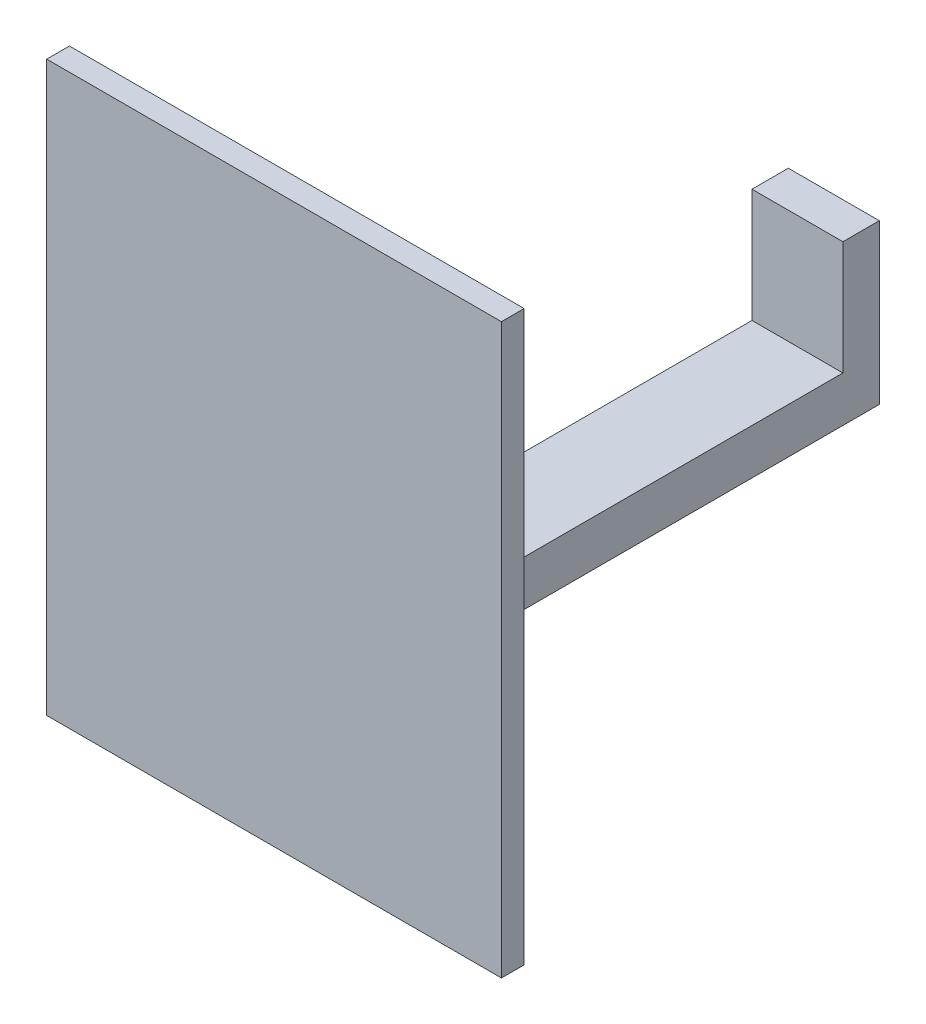
ISO-10303-21;
HEADER;
FILE_DESCRIPTION(('STEP AP214'),'2;1');
FILE_NAME('part.step','',(''),(''),'','','');
FILE_SCHEMA(('AUTOMOTIVE_DESIGN { 1 0 10303 214 1 1 1 1 }'));
ENDSEC;
DATA;
#1=APPLICATION_CONTEXT('core data for automotive mechanical design processes');
#2=APPLICATION_PROTOCOL_DEFINITION('international standard','automotive_design',2000,#1);
#3=PRODUCT_CONTEXT('',#1,'mechanical');
#4=PRODUCT('Part','Part','',(#3));
#5=PRODUCT_RELATED_PRODUCT_CATEGORY('part','',(#4));
#6=PRODUCT_DEFINITION_FORMATION('','',#4);
#7=PRODUCT_DEFINITION_CONTEXT('part definition',#1,'design');
#8=PRODUCT_DEFINITION('design','',#6,#7);
#9=PRODUCT_DEFINITION_SHAPE('','',#8);
#10=(LENGTH_UNIT() NAMED_UNIT(*) SI_UNIT(.MILLI.,.METRE.));
#11=(NAMED_UNIT(*) PLANE_ANGLE_UNIT() SI_UNIT($,.RADIAN.));
#12=(NAMED_UNIT(*) SI_UNIT($,.STERADIAN.) SOLID_ANGLE_UNIT());
#13=UNCERTAINTY_MEASURE_WITH_UNIT(LENGTH_MEASURE(1.E-05),#10,'distance_accuracy_value','');
#14=(GEOMETRIC_REPRESENTATION_CONTEXT(3) GLOBAL_UNCERTAINTY_ASSIGNED_CONTEXT((#13)) GLOBAL_UNIT_ASSIGNED_CONTEXT((#10,
#11,#12)) REPRESENTATION_CONTEXT('',''));
#15=CARTESIAN_POINT('',(0.,0.,0.));
#16=DIRECTION('',(0.,0.,1.));
#17=DIRECTION('',(1.,0.,0.));
#18=AXIS2_PLACEMENT_3D('',#15,#16,#17);
#19=CARTESIAN_POINT('',(20.,70.,-8.));
#20=DIRECTION('',(-1.,0.,0.));
#21=DIRECTION('',(0.,0.,1.));
#22=AXIS2_PLACEMENT_3D('',#19,#20,#21);
#23=PLANE('',#22);
#24=DIRECTION('',(0.,0.,-1.));
#25=VECTOR('',#24,1.);
#26=CARTESIAN_POINT('',(20.,0.,-8.));
#27=LINE('',#26,#25);
#28=CARTESIAN_POINT('',(20.,0.,228.));
#29=VERTEX_POINT('',#28);
#30=CARTESIAN_POINT('',(20.,0.,-8.));
#31=VERTEX_POINT('',#30);
#32=EDGE_CURVE('E200',#29,#31,#27,.T.);
#33=ORIENTED_EDGE('',*,*,#32,.T.);
#34=DIRECTION('',(0.,-1.,0.));
#35=VECTOR('',#34,1.);
#36=CARTESIAN_POINT('',(20.,70.,-8.));
#37=LINE('',#36,#35);
#38=CARTESIAN_POINT('',(20.,70.,-8.));
#39=VERTEX_POINT('',#38);
#40=EDGE_CURVE('E11',#39,#31,#37,.T.);
#41=ORIENTED_EDGE('',*,*,#40,.F.);
#42=DIRECTION('',(0.,0.,-1.));
#43=VECTOR('',#42,1.);
#44=CARTESIAN_POINT('',(20.,70.,-8.));
#45=LINE('',#44,#43);
#46=CARTESIAN_POINT('',(20.,70.,8.));
#47=VERTEX_POINT('',#46);
#48=EDGE_CURVE('E201',#47,#39,#45,.T.);
#49=ORIENTED_EDGE('',*,*,#48,.F.);
#50=DIRECTION('',(0.,-1.,0.));
#51=VECTOR('',#50,1.);
#52=CARTESIAN_POINT('',(20.,70.,8.));
#53=LINE('',#52,#51);
#54=CARTESIAN_POINT('',(20.,20.,8.));
#55=VERTEX_POINT('',#54);
#56=EDGE_CURVE('E212',#47,#55,#53,.T.);
#57=ORIENTED_EDGE('',*,*,#56,.T.);
#58=DIRECTION('',(0.,0.,-1.));
#59=VECTOR('',#58,1.);
#60=CARTESIAN_POINT('',(20.,20.,228.));
#61=LINE('',#60,#59);
#62=CARTESIAN_POINT('',(20.,20.,228.));
#63=VERTEX_POINT('',#62);
#64=EDGE_CURVE('E54',#63,#55,#61,.T.);
#65=ORIENTED_EDGE('',*,*,#64,.F.);
#66=DIRECTION('',(0.,-1.,0.));
#67=VECTOR('',#66,1.);
#68=CARTESIAN_POINT('',(20.,20.,228.));
#69=LINE('',#68,#67);
#70=EDGE_CURVE('E182',#63,#29,#69,.T.);
#71=ORIENTED_EDGE('',*,*,#70,.T.);
#72=EDGE_LOOP('',(#33,#41,#49,#57,#65,#71));
#73=FACE_BOUND('',#72,.T.);
#74=ADVANCED_FACE('F39',(#73),#23,.F.);
#75=CARTESIAN_POINT('',(-20.,70.,-8.));
#76=DIRECTION('',(0.,0.,1.));
#77=DIRECTION('',(1.,0.,0.));
#78=AXIS2_PLACEMENT_3D('',#75,#76,#77);
#79=PLANE('',#78);
#80=DIRECTION('',(-1.,0.,0.));
#81=VECTOR('',#80,1.);
#82=CARTESIAN_POINT('',(-20.,0.,-8.));
#83=LINE('',#82,#81);
#84=CARTESIAN_POINT('',(-20.,0.,-8.));
#85=VERTEX_POINT('',#84);
#86=EDGE_CURVE('E77',#31,#85,#83,.T.);
#87=ORIENTED_EDGE('',*,*,#86,.T.);
#88=DIRECTION('',(0.,-1.,0.));
#89=VECTOR('',#88,1.);
#90=CARTESIAN_POINT('',(-20.,70.,-8.));
#91=LINE('',#90,#89);
#92=CARTESIAN_POINT('',(-20.,70.,-8.));
#93=VERTEX_POINT('',#92);
#94=EDGE_CURVE('E47',#93,#85,#91,.T.);
#95=ORIENTED_EDGE('',*,*,#94,.F.);
#96=DIRECTION('',(-1.,0.,0.));
#97=VECTOR('',#96,1.);
#98=CARTESIAN_POINT('',(-20.,70.,-8.));
#99=LINE('',#98,#97);
#100=EDGE_CURVE('E82',#39,#93,#99,.T.);
#101=ORIENTED_EDGE('',*,*,#100,.F.);
#102=ORIENTED_EDGE('',*,*,#40,.T.);
#103=EDGE_LOOP('',(#87,#95,#101,#102));
#104=FACE_BOUND('',#103,.T.);
#105=ADVANCED_FACE('F258',(#104),#79,.F.);
#106=CARTESIAN_POINT('',(-20.,70.,-8.));
#107=DIRECTION('',(1.,0.,0.));
#108=DIRECTION('',(0.,0.,-1.));
#109=AXIS2_PLACEMENT_3D('',#106,#107,#108);
#110=PLANE('',#109);
#111=DIRECTION('',(0.,0.,1.));
#112=VECTOR('',#111,1.);
#113=CARTESIAN_POINT('',(-20.,0.,-8.));
#114=LINE('',#113,#112);
#115=CARTESIAN_POINT('',(-20.,0.,228.));
#116=VERTEX_POINT('',#115);
#117=EDGE_CURVE('E204',#85,#116,#114,.T.);
#118=ORIENTED_EDGE('',*,*,#117,.T.);
#119=DIRECTION('',(0.,-1.,0.));
#120=VECTOR('',#119,1.);
#121=CARTESIAN_POINT('',(-20.,20.,228.));
#122=LINE('',#121,#120);
#123=CARTESIAN_POINT('',(-20.,20.,228.));
#124=VERTEX_POINT('',#123);
#125=EDGE_CURVE('E189',#124,#116,#122,.T.);
#126=ORIENTED_EDGE('',*,*,#125,.F.);
#127=DIRECTION('',(0.,0.,-1.));
#128=VECTOR('',#127,1.);
#129=CARTESIAN_POINT('',(-20.,20.,228.));
#130=LINE('',#129,#128);
#131=CARTESIAN_POINT('',(-20.,20.,8.));
#132=VERTEX_POINT('',#131);
#133=EDGE_CURVE('E193',#124,#132,#130,.T.);
#134=ORIENTED_EDGE('',*,*,#133,.T.);
#135=DIRECTION('',(0.,-1.,0.));
#136=VECTOR('',#135,1.);
#137=CARTESIAN_POINT('',(-20.,70.,8.));
#138=LINE('',#137,#136);
#139=CARTESIAN_POINT('',(-20.,70.,8.));
#140=VERTEX_POINT('',#139);
#141=EDGE_CURVE('E224',#140,#132,#138,.T.);
#142=ORIENTED_EDGE('',*,*,#141,.F.);
#143=DIRECTION('',(0.,0.,1.));
#144=VECTOR('',#143,1.);
#145=CARTESIAN_POINT('',(-20.,70.,-8.));
#146=LINE('',#145,#144);
#147=EDGE_CURVE('E207',#93,#140,#146,.T.);
#148=ORIENTED_EDGE('',*,*,#147,.F.);
#149=ORIENTED_EDGE('',*,*,#94,.T.);
#150=EDGE_LOOP('',(#118,#126,#134,#142,#148,#149));
#151=FACE_BOUND('',#150,.T.);
#152=ADVANCED_FACE('F231',(#151),#110,.F.);
#153=CARTESIAN_POINT('',(-20.,70.,8.));
#154=DIRECTION('',(0.,0.,-1.));
#155=DIRECTION('',(-1.,0.,0.));
#156=AXIS2_PLACEMENT_3D('',#153,#154,#155);
#157=PLANE('',#156);
#158=ORIENTED_EDGE('',*,*,#141,.T.);
#159=DIRECTION('',(1.,0.,0.));
#160=VECTOR('',#159,1.);
#161=CARTESIAN_POINT('',(-20.,20.,8.));
#162=LINE('',#161,#160);
#163=EDGE_CURVE('E147',#132,#55,#162,.T.);
#164=ORIENTED_EDGE('',*,*,#163,.T.);
#165=ORIENTED_EDGE('',*,*,#56,.F.);
#166=DIRECTION('',(1.,0.,0.));
#167=VECTOR('',#166,1.);
#168=CARTESIAN_POINT('',(-20.,70.,8.));
#169=LINE('',#168,#167);
#170=EDGE_CURVE('E63',#140,#47,#169,.T.);
#171=ORIENTED_EDGE('',*,*,#170,.F.);
#172=EDGE_LOOP('',(#158,#164,#165,#171));
#173=FACE_BOUND('',#172,.T.);
#174=ADVANCED_FACE('F243',(#173),#157,.F.);
#175=CARTESIAN_POINT('',(0.,70.,0.));
#176=DIRECTION('',(0.,1.,0.));
#177=DIRECTION('',(0.,0.,1.));
#178=AXIS2_PLACEMENT_3D('',#175,#176,#177);
#179=PLANE('',#178);
#180=ORIENTED_EDGE('',*,*,#48,.T.);
#181=ORIENTED_EDGE('',*,*,#100,.T.);
#182=ORIENTED_EDGE('',*,*,#147,.T.);
#183=ORIENTED_EDGE('',*,*,#170,.T.);
#184=EDGE_LOOP('',(#180,#181,#182,#183));
#185=FACE_BOUND('',#184,.T.);
#186=ADVANCED_FACE('F247',(#185),#179,.T.);
#187=CARTESIAN_POINT('',(0.,0.,0.));
#188=DIRECTION('',(0.,1.,0.));
#189=DIRECTION('',(0.,0.,1.));
#190=AXIS2_PLACEMENT_3D('',#187,#188,#189);
#191=PLANE('',#190);
#192=ORIENTED_EDGE('',*,*,#32,.F.);
#193=DIRECTION('',(1.,0.,0.));
#194=VECTOR('',#193,1.);
#195=CARTESIAN_POINT('',(-20.,0.,228.));
#196=LINE('',#195,#194);
#197=EDGE_CURVE('E178',#116,#29,#196,.T.);
#198=ORIENTED_EDGE('',*,*,#197,.F.);
#199=ORIENTED_EDGE('',*,*,#117,.F.);
#200=ORIENTED_EDGE('',*,*,#86,.F.);
#201=EDGE_LOOP('',(#192,#198,#199,#200));
#202=FACE_BOUND('',#201,.T.);
#203=ADVANCED_FACE('F235',(#202),#191,.F.);
#204=CARTESIAN_POINT('',(-20.,20.,228.));
#205=DIRECTION('',(0.,1.,0.));
#206=DIRECTION('',(-1.,0.,0.));
#207=AXIS2_PLACEMENT_3D('',#204,#205,#206);
#208=PLANE('',#207);
#209=ORIENTED_EDGE('',*,*,#163,.F.);
#210=ORIENTED_EDGE('',*,*,#133,.F.);
#211=DIRECTION('',(1.,0.,0.));
#212=VECTOR('',#211,1.);
#213=CARTESIAN_POINT('',(-20.,20.,228.));
#214=LINE('',#213,#212);
#215=EDGE_CURVE('E186',#124,#63,#214,.T.);
#216=ORIENTED_EDGE('',*,*,#215,.T.);
#217=ORIENTED_EDGE('',*,*,#64,.T.);
#218=EDGE_LOOP('',(#209,#210,#216,#217));
#219=FACE_BOUND('',#218,.T.);
#220=ADVANCED_FACE('F241',(#219),#208,.T.);
#221=CARTESIAN_POINT('',(-100.193037091588,-55.554712786959,238.));
#222=DIRECTION('',(0.,1.,0.));
#223=DIRECTION('',(0.,0.,1.));
#224=AXIS2_PLACEMENT_3D('',#221,#222,#223);
#225=PLANE('',#224);
#226=DIRECTION('',(1.,0.,0.));
#227=VECTOR('',#226,1.);
#228=CARTESIAN_POINT('',(-100.193037091588,-55.554712786959,228.));
#229=LINE('',#228,#227);
#230=CARTESIAN_POINT('',(-100.193037091588,-55.554712786959,228.));
#231=VERTEX_POINT('',#230);
#232=CARTESIAN_POINT('',(99.8069629084119,-55.554712786959,228.));
#233=VERTEX_POINT('',#232);
#234=EDGE_CURVE('E142',#231,#233,#229,.T.);
#235=ORIENTED_EDGE('',*,*,#234,.T.);
#236=DIRECTION('',(0.,0.,-1.));
#237=VECTOR('',#236,1.);
#238=CARTESIAN_POINT('',(99.8069629084119,-55.554712786959,238.));
#239=LINE('',#238,#237);
#240=CARTESIAN_POINT('',(99.8069629084119,-55.554712786959,238.));
#241=VERTEX_POINT('',#240);
#242=EDGE_CURVE('E139',#241,#233,#239,.T.);
#243=ORIENTED_EDGE('',*,*,#242,.F.);
#244=DIRECTION('',(1.,0.,0.));
#245=VECTOR('',#244,1.);
#246=CARTESIAN_POINT('',(-100.193037091588,-55.554712786959,238.));
#247=LINE('',#246,#245);
#248=CARTESIAN_POINT('',(-100.193037091588,-55.554712786959,238.));
#249=VERTEX_POINT('',#248);
#250=EDGE_CURVE('E123',#249,#241,#247,.T.);
#251=ORIENTED_EDGE('',*,*,#250,.F.);
#252=DIRECTION('',(0.,0.,-1.));
#253=VECTOR('',#252,1.);
#254=CARTESIAN_POINT('',(-100.193037091588,-55.554712786959,238.));
#255=LINE('',#254,#253);
#256=EDGE_CURVE('E159',#249,#231,#255,.T.);
#257=ORIENTED_EDGE('',*,*,#256,.T.);
#258=EDGE_LOOP('',(#235,#243,#251,#257));
#259=FACE_BOUND('',#258,.T.);
#260=ADVANCED_FACE('F140',(#259),#225,.F.);
#261=CARTESIAN_POINT('',(99.8069629084119,194.445287213041,238.));
#262=DIRECTION('',(1.,0.,0.));
#263=DIRECTION('',(0.,1.,0.));
#264=AXIS2_PLACEMENT_3D('',#261,#262,#263);
#265=PLANE('',#264);
#266=DIRECTION('',(0.,-1.,0.));
#267=VECTOR('',#266,1.);
#268=CARTESIAN_POINT('',(99.8069629084119,194.445287213041,228.));
#269=LINE('',#268,#267);
#270=CARTESIAN_POINT('',(99.8069629084119,194.445287213041,228.));
#271=VERTEX_POINT('',#270);
#272=EDGE_CURVE('E162',#271,#233,#269,.T.);
#273=ORIENTED_EDGE('',*,*,#272,.F.);
#274=DIRECTION('',(0.,0.,-1.));
#275=VECTOR('',#274,1.);
#276=CARTESIAN_POINT('',(99.8069629084119,194.445287213041,238.));
#277=LINE('',#276,#275);
#278=CARTESIAN_POINT('',(99.8069629084119,194.445287213041,238.));
#279=VERTEX_POINT('',#278);
#280=EDGE_CURVE('E148',#279,#271,#277,.T.);
#281=ORIENTED_EDGE('',*,*,#280,.F.);
#282=DIRECTION('',(0.,-1.,0.));
#283=VECTOR('',#282,1.);
#284=CARTESIAN_POINT('',(99.8069629084119,194.445287213041,238.));
#285=LINE('',#284,#283);
#286=EDGE_CURVE('E128',#279,#241,#285,.T.);
#287=ORIENTED_EDGE('',*,*,#286,.T.);
#288=ORIENTED_EDGE('',*,*,#242,.T.);
#289=EDGE_LOOP('',(#273,#281,#287,#288));
#290=FACE_BOUND('',#289,.T.);
#291=ADVANCED_FACE('F150',(#290),#265,.T.);
#292=CARTESIAN_POINT('',(-100.193037091588,194.445287213041,238.));
#293=DIRECTION('',(0.,1.,0.));
#294=DIRECTION('',(0.,0.,1.));
#295=AXIS2_PLACEMENT_3D('',#292,#293,#294);
#296=PLANE('',#295);
#297=DIRECTION('',(1.,0.,0.));
#298=VECTOR('',#297,1.);
#299=CARTESIAN_POINT('',(-100.193037091588,194.445287213041,228.));
#300=LINE('',#299,#298);
#301=CARTESIAN_POINT('',(-100.193037091588,194.445287213041,228.));
#302=VERTEX_POINT('',#301);
#303=EDGE_CURVE('E165',#302,#271,#300,.T.);
#304=ORIENTED_EDGE('',*,*,#303,.F.);
#305=DIRECTION('',(0.,0.,-1.));
#306=VECTOR('',#305,1.);
#307=CARTESIAN_POINT('',(-100.193037091588,194.445287213041,238.));
#308=LINE('',#307,#306);
#309=CARTESIAN_POINT('',(-100.193037091588,194.445287213041,238.));
#310=VERTEX_POINT('',#309);
#311=EDGE_CURVE('E173',#310,#302,#308,.T.);
#312=ORIENTED_EDGE('',*,*,#311,.F.);
#313=DIRECTION('',(1.,0.,0.));
#314=VECTOR('',#313,1.);
#315=CARTESIAN_POINT('',(-100.193037091588,194.445287213041,238.));
#316=LINE('',#315,#314);
#317=EDGE_CURVE('E152',#310,#279,#316,.T.);
#318=ORIENTED_EDGE('',*,*,#317,.T.);
#319=ORIENTED_EDGE('',*,*,#280,.T.);
#320=EDGE_LOOP('',(#304,#312,#318,#319));
#321=FACE_BOUND('',#320,.T.);
#322=ADVANCED_FACE('F318',(#321),#296,.T.);
#323=CARTESIAN_POINT('',(-100.193037091588,194.445287213041,238.));
#324=DIRECTION('',(1.,0.,0.));
#325=DIRECTION('',(0.,1.,0.));
#326=AXIS2_PLACEMENT_3D('',#323,#324,#325);
#327=PLANE('',#326);
#328=DIRECTION('',(0.,-1.,0.));
#329=VECTOR('',#328,1.);
#330=CARTESIAN_POINT('',(-100.193037091588,194.445287213041,228.));
#331=LINE('',#330,#329);
#332=EDGE_CURVE('E136',#302,#231,#331,.T.);
#333=ORIENTED_EDGE('',*,*,#332,.T.);
#334=ORIENTED_EDGE('',*,*,#256,.F.);
#335=DIRECTION('',(0.,-1.,0.));
#336=VECTOR('',#335,1.);
#337=CARTESIAN_POINT('',(-100.193037091588,194.445287213041,238.));
#338=LINE('',#337,#336);
#339=EDGE_CURVE('E131',#310,#249,#338,.T.);
#340=ORIENTED_EDGE('',*,*,#339,.F.);
#341=ORIENTED_EDGE('',*,*,#311,.T.);
#342=EDGE_LOOP('',(#333,#334,#340,#341));
#343=FACE_BOUND('',#342,.T.);
#344=ADVANCED_FACE('F326',(#343),#327,.F.);
#345=CARTESIAN_POINT('',(0.,0.,238.));
#346=DIRECTION('',(0.,0.,-1.));
#347=DIRECTION('',(-1.,0.,0.));
#348=AXIS2_PLACEMENT_3D('',#345,#346,#347);
#349=PLANE('',#348);
#350=ORIENTED_EDGE('',*,*,#250,.T.);
#351=ORIENTED_EDGE('',*,*,#286,.F.);
#352=ORIENTED_EDGE('',*,*,#317,.F.);
#353=ORIENTED_EDGE('',*,*,#339,.T.);
#354=EDGE_LOOP('',(#350,#351,#352,#353));
#355=FACE_BOUND('',#354,.T.);
#356=ADVANCED_FACE('F125',(#355),#349,.F.);
#357=CARTESIAN_POINT('',(0.,0.,228.));
#358=DIRECTION('',(0.,0.,-1.));
#359=DIRECTION('',(-1.,0.,0.));
#360=AXIS2_PLACEMENT_3D('',#357,#358,#359);
#361=PLANE('',#360);
#362=ORIENTED_EDGE('',*,*,#125,.T.);
#363=ORIENTED_EDGE('',*,*,#197,.T.);
#364=ORIENTED_EDGE('',*,*,#70,.F.);
#365=ORIENTED_EDGE('',*,*,#215,.F.);
#366=EDGE_LOOP('',(#362,#363,#364,#365));
#367=FACE_BOUND('',#366,.T.);
#368=ORIENTED_EDGE('',*,*,#234,.F.);
#369=ORIENTED_EDGE('',*,*,#332,.F.);
#370=ORIENTED_EDGE('',*,*,#303,.T.);
#371=ORIENTED_EDGE('',*,*,#272,.T.);
#372=EDGE_LOOP('',(#368,#369,#370,#371));
#373=FACE_BOUND('',#372,.T.);
#374=ADVANCED_FACE('F238',(#367,#373),#361,.T.);
#375=CLOSED_SHELL('',(#74,#105,#152,#174,#186,#203,#220,#260,#291,#322,#344,#356,#374));
#376=MANIFOLD_SOLID_BREP('B2',#375);
#377=ADVANCED_BREP_SHAPE_REPRESENTATION('',(#18,#376),#14);
#378=SHAPE_DEFINITION_REPRESENTATION(#9,#377);
ENDSEC;
END-ISO-10303-21;
